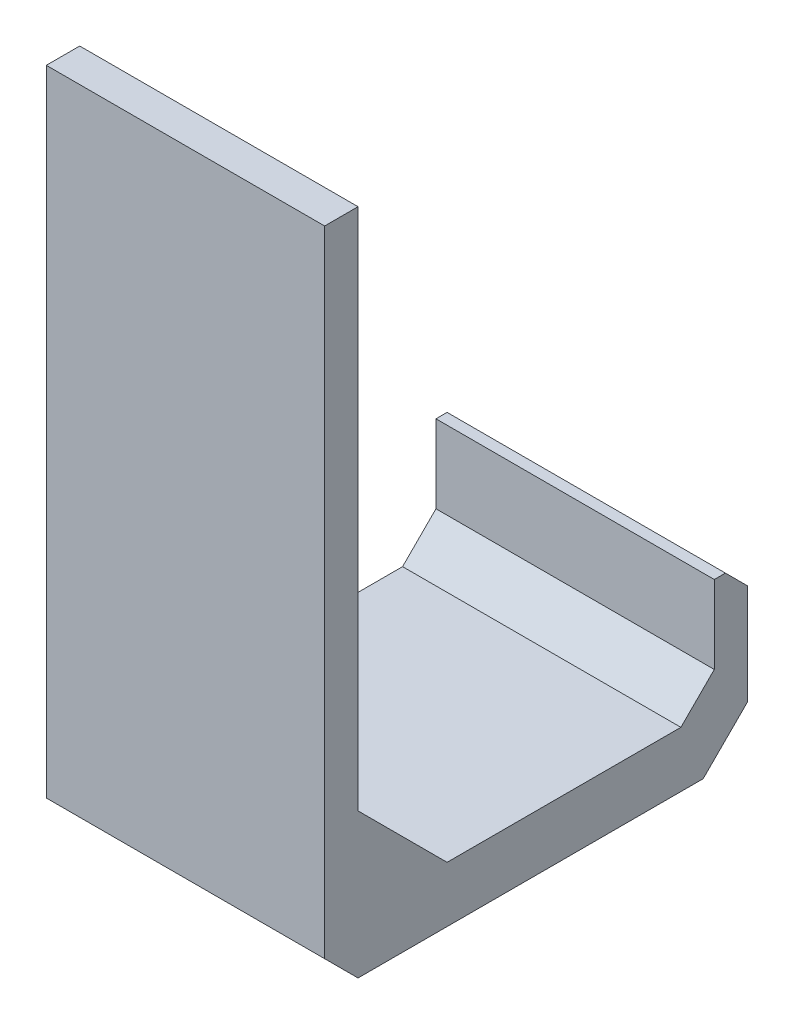
ISO-10303-21;
HEADER;
FILE_DESCRIPTION(('STEP AP214'),'2;1');
FILE_NAME('part.step','',(''),(''),'','','');
FILE_SCHEMA(('AUTOMOTIVE_DESIGN { 1 0 10303 214 1 1 1 1 }'));
ENDSEC;
DATA;
#1=APPLICATION_CONTEXT('core data for automotive mechanical design processes');
#2=APPLICATION_PROTOCOL_DEFINITION('international standard','automotive_design',2000,#1);
#3=PRODUCT_CONTEXT('',#1,'mechanical');
#4=PRODUCT('Part','Part','',(#3));
#5=PRODUCT_RELATED_PRODUCT_CATEGORY('part','',(#4));
#6=PRODUCT_DEFINITION_FORMATION('','',#4);
#7=PRODUCT_DEFINITION_CONTEXT('part definition',#1,'design');
#8=PRODUCT_DEFINITION('design','',#6,#7);
#9=PRODUCT_DEFINITION_SHAPE('','',#8);
#10=(LENGTH_UNIT() NAMED_UNIT(*) SI_UNIT(.MILLI.,.METRE.));
#11=(NAMED_UNIT(*) PLANE_ANGLE_UNIT() SI_UNIT($,.RADIAN.));
#12=(NAMED_UNIT(*) SI_UNIT($,.STERADIAN.) SOLID_ANGLE_UNIT());
#13=UNCERTAINTY_MEASURE_WITH_UNIT(LENGTH_MEASURE(1.E-05),#10,'distance_accuracy_value','');
#14=(GEOMETRIC_REPRESENTATION_CONTEXT(3) GLOBAL_UNCERTAINTY_ASSIGNED_CONTEXT((#13)) GLOBAL_UNIT_ASSIGNED_CONTEXT((#10,
#11,#12)) REPRESENTATION_CONTEXT('',''));
#15=CARTESIAN_POINT('',(0.,0.,0.));
#16=DIRECTION('',(0.,0.,1.));
#17=DIRECTION('',(1.,0.,0.));
#18=AXIS2_PLACEMENT_3D('',#15,#16,#17);
#19=CARTESIAN_POINT('',(25.,11.0227272727273,10.2272727272727));
#20=DIRECTION('',(0.,0.,-1.));
#21=DIRECTION('',(0.,1.,0.));
#22=AXIS2_PLACEMENT_3D('',#19,#20,#21);
#23=PLANE('',#22);
#24=DIRECTION('',(0.,-1.,0.));
#25=VECTOR('',#24,1.);
#26=CARTESIAN_POINT('',(0.,11.0227272727273,10.2272727272727));
#27=LINE('',#26,#25);
#28=CARTESIAN_POINT('',(0.,11.0227272727273,10.2272727272727));
#29=VERTEX_POINT('',#28);
#30=CARTESIAN_POINT('',(0.,-45.9772727272727,10.2272727272727));
#31=VERTEX_POINT('',#30);
#32=EDGE_CURVE('E163',#29,#31,#27,.T.);
#33=ORIENTED_EDGE('',*,*,#32,.T.);
#34=DIRECTION('',(1.,0.,0.));
#35=VECTOR('',#34,1.);
#36=CARTESIAN_POINT('',(25.,-45.9772727272727,10.2272727272727));
#37=LINE('',#36,#35);
#38=CARTESIAN_POINT('',(25.,-45.9772727272727,10.2272727272727));
#39=VERTEX_POINT('',#38);
#40=EDGE_CURVE('E200',#31,#39,#37,.T.);
#41=ORIENTED_EDGE('',*,*,#40,.T.);
#42=DIRECTION('',(0.,-1.,0.));
#43=VECTOR('',#42,1.);
#44=CARTESIAN_POINT('',(25.,11.0227272727273,10.2272727272727));
#45=LINE('',#44,#43);
#46=CARTESIAN_POINT('',(25.,11.0227272727273,10.2272727272727));
#47=VERTEX_POINT('',#46);
#48=EDGE_CURVE('E180',#47,#39,#45,.T.);
#49=ORIENTED_EDGE('',*,*,#48,.F.);
#50=DIRECTION('',(-1.,0.,0.));
#51=VECTOR('',#50,1.);
#52=CARTESIAN_POINT('',(25.,11.0227272727273,10.2272727272727));
#53=LINE('',#52,#51);
#54=EDGE_CURVE('E162',#47,#29,#53,.T.);
#55=ORIENTED_EDGE('',*,*,#54,.T.);
#56=EDGE_LOOP('',(#33,#41,#49,#55));
#57=FACE_BOUND('',#56,.T.);
#58=ADVANCED_FACE('F33',(#57),#23,.F.);
#59=CARTESIAN_POINT('',(25.,-48.9772727272727,7.22727272727274));
#60=DIRECTION('',(0.,1.,0.));
#61=DIRECTION('',(0.,0.,1.));
#62=AXIS2_PLACEMENT_3D('',#59,#60,#61);
#63=PLANE('',#62);
#64=DIRECTION('',(0.,0.,-1.));
#65=VECTOR('',#64,1.);
#66=CARTESIAN_POINT('',(0.,-48.9772727272727,7.22727272727274));
#67=LINE('',#66,#65);
#68=CARTESIAN_POINT('',(0.,-48.9772727272727,7.22727272727273));
#69=VERTEX_POINT('',#68);
#70=CARTESIAN_POINT('',(0.,-48.9772727272727,-23.7727272727272));
#71=VERTEX_POINT('',#70);
#72=EDGE_CURVE('E166',#69,#71,#67,.T.);
#73=ORIENTED_EDGE('',*,*,#72,.T.);
#74=DIRECTION('',(1.,0.,0.));
#75=VECTOR('',#74,1.);
#76=CARTESIAN_POINT('',(25.,-48.9772727272727,-23.7727272727272));
#77=LINE('',#76,#75);
#78=CARTESIAN_POINT('',(25.,-48.9772727272727,-23.7727272727272));
#79=VERTEX_POINT('',#78);
#80=EDGE_CURVE('E217',#71,#79,#77,.T.);
#81=ORIENTED_EDGE('',*,*,#80,.T.);
#82=DIRECTION('',(0.,0.,-1.));
#83=VECTOR('',#82,1.);
#84=CARTESIAN_POINT('',(25.,-48.9772727272727,10.2272727272727));
#85=LINE('',#84,#83);
#86=CARTESIAN_POINT('',(25.,-48.9772727272727,7.22727272727273));
#87=VERTEX_POINT('',#86);
#88=EDGE_CURVE('E253',#87,#79,#85,.T.);
#89=ORIENTED_EDGE('',*,*,#88,.F.);
#90=DIRECTION('',(-1.,0.,0.));
#91=VECTOR('',#90,1.);
#92=CARTESIAN_POINT('',(25.,-48.9772727272727,7.22727272727273));
#93=LINE('',#92,#91);
#94=EDGE_CURVE('E195',#87,#69,#93,.T.);
#95=ORIENTED_EDGE('',*,*,#94,.T.);
#96=EDGE_LOOP('',(#73,#81,#89,#95));
#97=FACE_BOUND('',#96,.T.);
#98=ADVANCED_FACE('F261',(#97),#63,.F.);
#99=CARTESIAN_POINT('',(25.,-43.9772727272727,-27.7727272727273));
#100=DIRECTION('',(0.,0.,1.));
#101=DIRECTION('',(1.,0.,0.));
#102=AXIS2_PLACEMENT_3D('',#99,#100,#101);
#103=PLANE('',#102);
#104=DIRECTION('',(0.,1.,0.));
#105=VECTOR('',#104,1.);
#106=CARTESIAN_POINT('',(0.,-43.9772727272727,-27.7727272727273));
#107=LINE('',#106,#105);
#108=CARTESIAN_POINT('',(0.,-44.9772727272727,-27.7727272727273));
#109=VERTEX_POINT('',#108);
#110=CARTESIAN_POINT('',(0.,-35.9772727272727,-27.7727272727273));
#111=VERTEX_POINT('',#110);
#112=EDGE_CURVE('E169',#109,#111,#107,.T.);
#113=ORIENTED_EDGE('',*,*,#112,.T.);
#114=DIRECTION('',(1.,0.,0.));
#115=VECTOR('',#114,1.);
#116=CARTESIAN_POINT('',(25.,-35.9772727272727,-27.7727272727273));
#117=LINE('',#116,#115);
#118=CARTESIAN_POINT('',(25.,-35.9772727272727,-27.7727272727273));
#119=VERTEX_POINT('',#118);
#120=EDGE_CURVE('E41',#111,#119,#117,.T.);
#121=ORIENTED_EDGE('',*,*,#120,.T.);
#122=DIRECTION('',(0.,1.,0.));
#123=VECTOR('',#122,1.);
#124=CARTESIAN_POINT('',(25.,-48.9772727272727,-27.7727272727273));
#125=LINE('',#124,#123);
#126=CARTESIAN_POINT('',(25.,-44.9772727272727,-27.7727272727273));
#127=VERTEX_POINT('',#126);
#128=EDGE_CURVE('E138',#127,#119,#125,.T.);
#129=ORIENTED_EDGE('',*,*,#128,.F.);
#130=DIRECTION('',(-1.,0.,0.));
#131=VECTOR('',#130,1.);
#132=CARTESIAN_POINT('',(25.,-44.9772727272727,-27.7727272727273));
#133=LINE('',#132,#131);
#134=EDGE_CURVE('E212',#127,#109,#133,.T.);
#135=ORIENTED_EDGE('',*,*,#134,.T.);
#136=EDGE_LOOP('',(#113,#121,#129,#135));
#137=FACE_BOUND('',#136,.T.);
#138=ADVANCED_FACE('F268',(#137),#103,.F.);
#139=CARTESIAN_POINT('',(25.,-33.9772727272727,-27.7727272727273));
#140=DIRECTION('',(0.,-1.,0.));
#141=DIRECTION('',(0.,0.,-1.));
#142=AXIS2_PLACEMENT_3D('',#139,#140,#141);
#143=PLANE('',#142);
#144=DIRECTION('',(0.,0.,1.));
#145=VECTOR('',#144,1.);
#146=CARTESIAN_POINT('',(25.,-33.9772727272727,-27.7727272727273));
#147=LINE('',#146,#145);
#148=CARTESIAN_POINT('',(25.,-33.9772727272727,-25.7727272727272));
#149=VERTEX_POINT('',#148);
#150=CARTESIAN_POINT('',(25.,-33.9772727272727,-24.7727272727273));
#151=VERTEX_POINT('',#150);
#152=EDGE_CURVE('E128',#149,#151,#147,.T.);
#153=ORIENTED_EDGE('',*,*,#152,.F.);
#154=DIRECTION('',(-1.,0.,0.));
#155=VECTOR('',#154,1.);
#156=CARTESIAN_POINT('',(25.,-33.9772727272727,-25.7727272727272));
#157=LINE('',#156,#155);
#158=CARTESIAN_POINT('',(0.,-33.9772727272727,-25.7727272727272));
#159=VERTEX_POINT('',#158);
#160=EDGE_CURVE('E221',#149,#159,#157,.T.);
#161=ORIENTED_EDGE('',*,*,#160,.T.);
#162=DIRECTION('',(0.,0.,1.));
#163=VECTOR('',#162,1.);
#164=CARTESIAN_POINT('',(0.,-33.9772727272727,-27.7727272727273));
#165=LINE('',#164,#163);
#166=CARTESIAN_POINT('',(0.,-33.9772727272727,-24.7727272727273));
#167=VERTEX_POINT('',#166);
#168=EDGE_CURVE('E143',#159,#167,#165,.T.);
#169=ORIENTED_EDGE('',*,*,#168,.T.);
#170=DIRECTION('',(-1.,0.,0.));
#171=VECTOR('',#170,1.);
#172=CARTESIAN_POINT('',(25.,-33.9772727272727,-24.7727272727273));
#173=LINE('',#172,#171);
#174=EDGE_CURVE('E141',#151,#167,#173,.T.);
#175=ORIENTED_EDGE('',*,*,#174,.F.);
#176=EDGE_LOOP('',(#153,#161,#169,#175));
#177=FACE_BOUND('',#176,.T.);
#178=ADVANCED_FACE('F142',(#177),#143,.F.);
#179=CARTESIAN_POINT('',(25.,-43.9772727272727,-24.7727272727273));
#180=DIRECTION('',(0.,0.,-1.));
#181=DIRECTION('',(0.,1.,0.));
#182=AXIS2_PLACEMENT_3D('',#179,#180,#181);
#183=PLANE('',#182);
#184=DIRECTION('',(0.,-1.,0.));
#185=VECTOR('',#184,1.);
#186=CARTESIAN_POINT('',(0.,-43.9772727272727,-24.7727272727273));
#187=LINE('',#186,#185);
#188=CARTESIAN_POINT('',(0.,-40.9772727272727,-24.7727272727273));
#189=VERTEX_POINT('',#188);
#190=EDGE_CURVE('E172',#167,#189,#187,.T.);
#191=ORIENTED_EDGE('',*,*,#190,.T.);
#192=DIRECTION('',(1.,0.,0.));
#193=VECTOR('',#192,1.);
#194=CARTESIAN_POINT('',(25.,-40.9772727272727,-24.7727272727273));
#195=LINE('',#194,#193);
#196=CARTESIAN_POINT('',(25.,-40.9772727272727,-24.7727272727273));
#197=VERTEX_POINT('',#196);
#198=EDGE_CURVE('E152',#189,#197,#195,.T.);
#199=ORIENTED_EDGE('',*,*,#198,.T.);
#200=DIRECTION('',(0.,-1.,0.));
#201=VECTOR('',#200,1.);
#202=CARTESIAN_POINT('',(25.,-43.9772727272727,-24.7727272727273));
#203=LINE('',#202,#201);
#204=EDGE_CURVE('E132',#151,#197,#203,.T.);
#205=ORIENTED_EDGE('',*,*,#204,.F.);
#206=ORIENTED_EDGE('',*,*,#174,.T.);
#207=EDGE_LOOP('',(#191,#199,#205,#206));
#208=FACE_BOUND('',#207,.T.);
#209=ADVANCED_FACE('F150',(#208),#183,.F.);
#210=CARTESIAN_POINT('',(25.,-43.9772727272727,7.22727272727274));
#211=DIRECTION('',(0.,-1.,0.));
#212=DIRECTION('',(0.,0.,-1.));
#213=AXIS2_PLACEMENT_3D('',#210,#211,#212);
#214=PLANE('',#213);
#215=DIRECTION('',(0.,0.,1.));
#216=VECTOR('',#215,1.);
#217=CARTESIAN_POINT('',(25.,-43.9772727272727,7.22727272727274));
#218=LINE('',#217,#216);
#219=CARTESIAN_POINT('',(25.,-43.9772727272727,-21.7727272727272));
#220=VERTEX_POINT('',#219);
#221=CARTESIAN_POINT('',(25.,-43.9772727272727,-0.772727272727236));
#222=VERTEX_POINT('',#221);
#223=EDGE_CURVE('E153',#220,#222,#218,.T.);
#224=ORIENTED_EDGE('',*,*,#223,.F.);
#225=DIRECTION('',(-1.,0.,0.));
#226=VECTOR('',#225,1.);
#227=CARTESIAN_POINT('',(0.,-43.9772727272727,-21.7727272727272));
#228=LINE('',#227,#226);
#229=CARTESIAN_POINT('',(0.,-43.9772727272727,-21.7727272727272));
#230=VERTEX_POINT('',#229);
#231=EDGE_CURVE('E204',#220,#230,#228,.T.);
#232=ORIENTED_EDGE('',*,*,#231,.T.);
#233=DIRECTION('',(0.,0.,1.));
#234=VECTOR('',#233,1.);
#235=CARTESIAN_POINT('',(0.,-43.9772727272727,7.22727272727274));
#236=LINE('',#235,#234);
#237=CARTESIAN_POINT('',(0.,-43.9772727272727,-0.772727272727236));
#238=VERTEX_POINT('',#237);
#239=EDGE_CURVE('E174',#230,#238,#236,.T.);
#240=ORIENTED_EDGE('',*,*,#239,.T.);
#241=DIRECTION('',(1.,0.,0.));
#242=VECTOR('',#241,1.);
#243=CARTESIAN_POINT('',(25.,-43.9772727272727,-0.772727272727237));
#244=LINE('',#243,#242);
#245=EDGE_CURVE('E187',#238,#222,#244,.T.);
#246=ORIENTED_EDGE('',*,*,#245,.T.);
#247=EDGE_LOOP('',(#224,#232,#240,#246));
#248=FACE_BOUND('',#247,.T.);
#249=ADVANCED_FACE('F231',(#248),#214,.F.);
#250=CARTESIAN_POINT('',(25.,11.0227272727273,7.22727272727275));
#251=DIRECTION('',(0.,0.,1.));
#252=DIRECTION('',(0.,-1.,0.));
#253=AXIS2_PLACEMENT_3D('',#250,#251,#252);
#254=PLANE('',#253);
#255=DIRECTION('',(0.,1.,0.));
#256=VECTOR('',#255,1.);
#257=CARTESIAN_POINT('',(25.,11.0227272727273,7.22727272727275));
#258=LINE('',#257,#256);
#259=CARTESIAN_POINT('',(25.,-35.9772727272726,7.22727272727274));
#260=VERTEX_POINT('',#259);
#261=CARTESIAN_POINT('',(25.,11.0227272727273,7.22727272727275));
#262=VERTEX_POINT('',#261);
#263=EDGE_CURVE('E155',#260,#262,#258,.T.);
#264=ORIENTED_EDGE('',*,*,#263,.F.);
#265=DIRECTION('',(-1.,0.,0.));
#266=VECTOR('',#265,1.);
#267=CARTESIAN_POINT('',(0.,-35.9772727272726,7.22727272727274));
#268=LINE('',#267,#266);
#269=CARTESIAN_POINT('',(0.,-35.9772727272726,7.22727272727274));
#270=VERTEX_POINT('',#269);
#271=EDGE_CURVE('E147',#260,#270,#268,.T.);
#272=ORIENTED_EDGE('',*,*,#271,.T.);
#273=DIRECTION('',(0.,1.,0.));
#274=VECTOR('',#273,1.);
#275=CARTESIAN_POINT('',(0.,11.0227272727273,7.22727272727275));
#276=LINE('',#275,#274);
#277=CARTESIAN_POINT('',(0.,11.0227272727273,7.22727272727275));
#278=VERTEX_POINT('',#277);
#279=EDGE_CURVE('E176',#270,#278,#276,.T.);
#280=ORIENTED_EDGE('',*,*,#279,.T.);
#281=DIRECTION('',(-1.,0.,0.));
#282=VECTOR('',#281,1.);
#283=CARTESIAN_POINT('',(25.,11.0227272727273,7.22727272727275));
#284=LINE('',#283,#282);
#285=EDGE_CURVE('E148',#262,#278,#284,.T.);
#286=ORIENTED_EDGE('',*,*,#285,.F.);
#287=EDGE_LOOP('',(#264,#272,#280,#286));
#288=FACE_BOUND('',#287,.T.);
#289=ADVANCED_FACE('F240',(#288),#254,.F.);
#290=CARTESIAN_POINT('',(25.,11.0227272727273,10.2272727272727));
#291=DIRECTION('',(0.,-1.,0.));
#292=DIRECTION('',(0.,0.,-1.));
#293=AXIS2_PLACEMENT_3D('',#290,#291,#292);
#294=PLANE('',#293);
#295=DIRECTION('',(0.,0.,1.));
#296=VECTOR('',#295,1.);
#297=CARTESIAN_POINT('',(0.,11.0227272727273,10.2272727272727));
#298=LINE('',#297,#296);
#299=EDGE_CURVE('E178',#278,#29,#298,.T.);
#300=ORIENTED_EDGE('',*,*,#299,.T.);
#301=ORIENTED_EDGE('',*,*,#54,.F.);
#302=DIRECTION('',(0.,0.,1.));
#303=VECTOR('',#302,1.);
#304=CARTESIAN_POINT('',(25.,11.0227272727273,10.2272727272727));
#305=LINE('',#304,#303);
#306=EDGE_CURVE('E160',#262,#47,#305,.T.);
#307=ORIENTED_EDGE('',*,*,#306,.F.);
#308=ORIENTED_EDGE('',*,*,#285,.T.);
#309=EDGE_LOOP('',(#300,#301,#307,#308));
#310=FACE_BOUND('',#309,.T.);
#311=ADVANCED_FACE('F246',(#310),#294,.F.);
#312=CARTESIAN_POINT('',(25.,0.,0.));
#313=DIRECTION('',(1.,0.,0.));
#314=DIRECTION('',(0.,0.,-1.));
#315=AXIS2_PLACEMENT_3D('',#312,#313,#314);
#316=PLANE('',#315);
#317=ORIENTED_EDGE('',*,*,#128,.T.);
#318=DIRECTION('',(0.,-0.707106781186549,-0.707106781186546));
#319=VECTOR('',#318,1.);
#320=CARTESIAN_POINT('',(25.,-4.10227272727267,4.10227272727269));
#321=LINE('',#320,#319);
#322=EDGE_CURVE('E11',#119,#149,#321,.F.);
#323=ORIENTED_EDGE('',*,*,#322,.T.);
#324=ORIENTED_EDGE('',*,*,#152,.T.);
#325=ORIENTED_EDGE('',*,*,#204,.T.);
#326=DIRECTION('',(0.,0.707106781186543,-0.707106781186552));
#327=VECTOR('',#326,1.);
#328=CARTESIAN_POINT('',(25.,-43.9772727272727,-21.7727272727272));
#329=LINE('',#328,#327);
#330=EDGE_CURVE('E210',#197,#220,#329,.F.);
#331=ORIENTED_EDGE('',*,*,#330,.T.);
#332=ORIENTED_EDGE('',*,*,#223,.T.);
#333=DIRECTION('',(0.,-0.707106781186551,-0.707106781186544));
#334=VECTOR('',#333,1.);
#335=CARTESIAN_POINT('',(25.,-35.9772727272726,7.22727272727274));
#336=LINE('',#335,#334);
#337=EDGE_CURVE('E193',#222,#260,#336,.F.);
#338=ORIENTED_EDGE('',*,*,#337,.T.);
#339=ORIENTED_EDGE('',*,*,#263,.T.);
#340=ORIENTED_EDGE('',*,*,#306,.T.);
#341=ORIENTED_EDGE('',*,*,#48,.T.);
#342=DIRECTION('',(0.,0.707106781186548,0.707106781186547));
#343=VECTOR('',#342,1.);
#344=CARTESIAN_POINT('',(25.,-28.1022727272727,28.1022727272727));
#345=LINE('',#344,#343);
#346=EDGE_CURVE('E202',#39,#87,#345,.F.);
#347=ORIENTED_EDGE('',*,*,#346,.T.);
#348=ORIENTED_EDGE('',*,*,#88,.T.);
#349=DIRECTION('',(0.,-0.707106781186546,0.707106781186549));
#350=VECTOR('',#349,1.);
#351=CARTESIAN_POINT('',(25.,-36.3750000000001,-36.3749999999999));
#352=LINE('',#351,#350);
#353=EDGE_CURVE('E219',#79,#127,#352,.F.);
#354=ORIENTED_EDGE('',*,*,#353,.T.);
#355=EDGE_LOOP('',(#317,#323,#324,#325,#331,#332,#338,#339,#340,#341,#347,#348,#354));
#356=FACE_BOUND('',#355,.T.);
#357=ADVANCED_FACE('F130',(#356),#316,.T.);
#358=CARTESIAN_POINT('',(0.,0.,0.));
#359=DIRECTION('',(1.,0.,0.));
#360=DIRECTION('',(0.,0.,-1.));
#361=AXIS2_PLACEMENT_3D('',#358,#359,#360);
#362=PLANE('',#361);
#363=ORIENTED_EDGE('',*,*,#168,.F.);
#364=DIRECTION('',(0.,0.707106781186549,0.707106781186546));
#365=VECTOR('',#364,1.);
#366=CARTESIAN_POINT('',(0.,-33.9772727272727,-25.7727272727273));
#367=LINE('',#366,#365);
#368=EDGE_CURVE('E55',#159,#111,#367,.F.);
#369=ORIENTED_EDGE('',*,*,#368,.T.);
#370=ORIENTED_EDGE('',*,*,#112,.F.);
#371=DIRECTION('',(0.,0.707106781186546,-0.707106781186549));
#372=VECTOR('',#371,1.);
#373=CARTESIAN_POINT('',(0.,-44.9772727272727,-27.7727272727273));
#374=LINE('',#373,#372);
#375=EDGE_CURVE('E215',#109,#71,#374,.F.);
#376=ORIENTED_EDGE('',*,*,#375,.T.);
#377=ORIENTED_EDGE('',*,*,#72,.F.);
#378=DIRECTION('',(0.,-0.707106781186548,-0.707106781186547));
#379=VECTOR('',#378,1.);
#380=CARTESIAN_POINT('',(0.,-48.9772727272727,7.22727272727273));
#381=LINE('',#380,#379);
#382=EDGE_CURVE('E198',#69,#31,#381,.F.);
#383=ORIENTED_EDGE('',*,*,#382,.T.);
#384=ORIENTED_EDGE('',*,*,#32,.F.);
#385=ORIENTED_EDGE('',*,*,#299,.F.);
#386=ORIENTED_EDGE('',*,*,#279,.F.);
#387=DIRECTION('',(0.,0.707106781186551,0.707106781186544));
#388=VECTOR('',#387,1.);
#389=CARTESIAN_POINT('',(0.,-21.6022727272725,21.6022727272727));
#390=LINE('',#389,#388);
#391=EDGE_CURVE('E190',#270,#238,#390,.F.);
#392=ORIENTED_EDGE('',*,*,#391,.T.);
#393=ORIENTED_EDGE('',*,*,#239,.F.);
#394=DIRECTION('',(0.,-0.707106781186543,0.707106781186552));
#395=VECTOR('',#394,1.);
#396=CARTESIAN_POINT('',(0.,-32.8750000000002,-32.8749999999999));
#397=LINE('',#396,#395);
#398=EDGE_CURVE('E208',#230,#189,#397,.F.);
#399=ORIENTED_EDGE('',*,*,#398,.T.);
#400=ORIENTED_EDGE('',*,*,#190,.F.);
#401=EDGE_LOOP('',(#363,#369,#370,#376,#377,#383,#384,#385,#386,#392,#393,#399,#400));
#402=FACE_BOUND('',#401,.T.);
#403=ADVANCED_FACE('F224',(#402),#362,.F.);
#404=CARTESIAN_POINT('',(25.,-35.9772727272726,7.22727272727274));
#405=DIRECTION('',(0.,0.707106781186544,-0.707106781186551));
#406=DIRECTION('',(1.,0.,0.));
#407=AXIS2_PLACEMENT_3D('',#404,#405,#406);
#408=PLANE('',#407);
#409=ORIENTED_EDGE('',*,*,#337,.F.);
#410=ORIENTED_EDGE('',*,*,#245,.F.);
#411=ORIENTED_EDGE('',*,*,#391,.F.);
#412=ORIENTED_EDGE('',*,*,#271,.F.);
#413=EDGE_LOOP('',(#409,#410,#411,#412));
#414=FACE_BOUND('',#413,.T.);
#415=ADVANCED_FACE('F236',(#414),#408,.T.);
#416=CARTESIAN_POINT('',(25.,-48.9772727272727,7.22727272727273));
#417=DIRECTION('',(0.,0.707106781186547,-0.707106781186548));
#418=DIRECTION('',(-1.,0.,0.));
#419=AXIS2_PLACEMENT_3D('',#416,#417,#418);
#420=PLANE('',#419);
#421=ORIENTED_EDGE('',*,*,#346,.F.);
#422=ORIENTED_EDGE('',*,*,#40,.F.);
#423=ORIENTED_EDGE('',*,*,#382,.F.);
#424=ORIENTED_EDGE('',*,*,#94,.F.);
#425=EDGE_LOOP('',(#421,#422,#423,#424));
#426=FACE_BOUND('',#425,.T.);
#427=ADVANCED_FACE('F258',(#426),#420,.F.);
#428=CARTESIAN_POINT('',(25.,-43.9772727272727,-21.7727272727272));
#429=DIRECTION('',(0.,0.707106781186552,0.707106781186543));
#430=DIRECTION('',(1.,0.,0.));
#431=AXIS2_PLACEMENT_3D('',#428,#429,#430);
#432=PLANE('',#431);
#433=ORIENTED_EDGE('',*,*,#330,.F.);
#434=ORIENTED_EDGE('',*,*,#198,.F.);
#435=ORIENTED_EDGE('',*,*,#398,.F.);
#436=ORIENTED_EDGE('',*,*,#231,.F.);
#437=EDGE_LOOP('',(#433,#434,#435,#436));
#438=FACE_BOUND('',#437,.T.);
#439=ADVANCED_FACE('F227',(#438),#432,.T.);
#440=CARTESIAN_POINT('',(25.,-44.9772727272727,-27.7727272727273));
#441=DIRECTION('',(0.,0.707106781186549,0.707106781186546));
#442=DIRECTION('',(-1.,0.,0.));
#443=AXIS2_PLACEMENT_3D('',#440,#441,#442);
#444=PLANE('',#443);
#445=ORIENTED_EDGE('',*,*,#353,.F.);
#446=ORIENTED_EDGE('',*,*,#80,.F.);
#447=ORIENTED_EDGE('',*,*,#375,.F.);
#448=ORIENTED_EDGE('',*,*,#134,.F.);
#449=EDGE_LOOP('',(#445,#446,#447,#448));
#450=FACE_BOUND('',#449,.T.);
#451=ADVANCED_FACE('F267',(#450),#444,.F.);
#452=CARTESIAN_POINT('',(25.,-33.9772727272727,-25.7727272727273));
#453=DIRECTION('',(0.,-0.707106781186546,0.707106781186549));
#454=DIRECTION('',(-1.,0.,0.));
#455=AXIS2_PLACEMENT_3D('',#452,#453,#454);
#456=PLANE('',#455);
#457=ORIENTED_EDGE('',*,*,#322,.F.);
#458=ORIENTED_EDGE('',*,*,#120,.F.);
#459=ORIENTED_EDGE('',*,*,#368,.F.);
#460=ORIENTED_EDGE('',*,*,#160,.F.);
#461=EDGE_LOOP('',(#457,#458,#459,#460));
#462=FACE_BOUND('',#461,.T.);
#463=ADVANCED_FACE('F35',(#462),#456,.F.);
#464=CLOSED_SHELL('',(#58,#98,#138,#178,#209,#249,#289,#311,#357,#403,#415,#427,#439,#451,#463));
#465=MANIFOLD_SOLID_BREP('B2',#464);
#466=ADVANCED_BREP_SHAPE_REPRESENTATION('',(#18,#465),#14);
#467=SHAPE_DEFINITION_REPRESENTATION(#9,#466);
ENDSEC;
END-ISO-10303-21;
